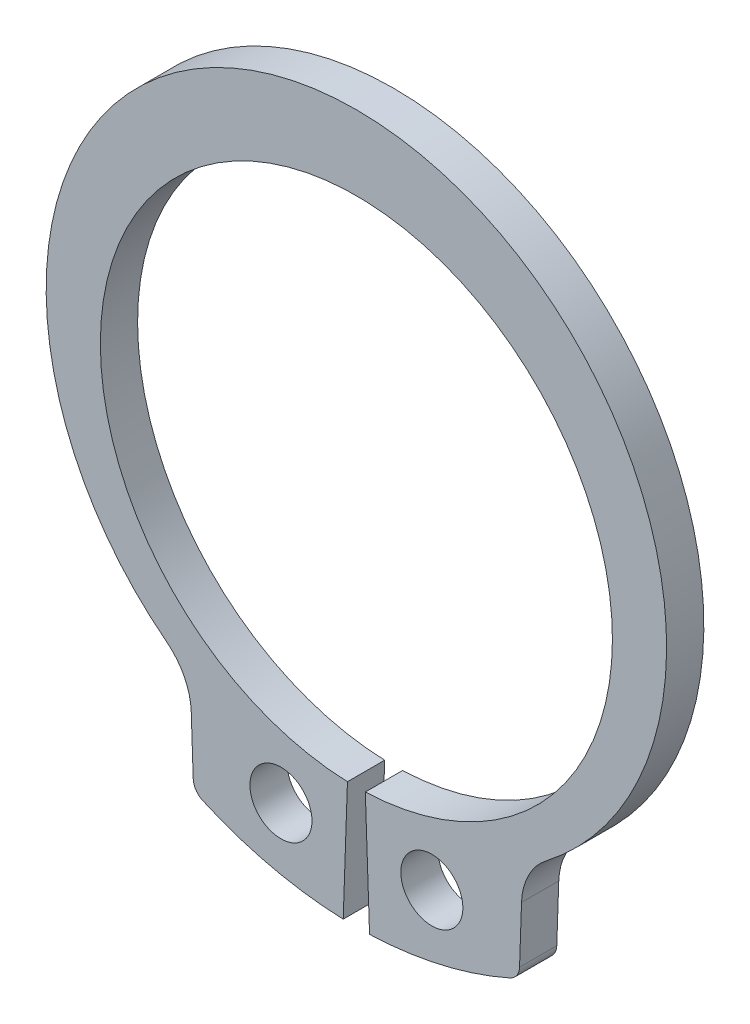
ISO-10303-21;
HEADER;
FILE_DESCRIPTION(('STEP AP214'),'2;1');
FILE_NAME('part.step','',(''),(''),'','','');
FILE_SCHEMA(('AUTOMOTIVE_DESIGN { 1 0 10303 214 1 1 1 1 }'));
ENDSEC;
DATA;
#1=APPLICATION_CONTEXT('core data for automotive mechanical design processes');
#2=APPLICATION_PROTOCOL_DEFINITION('international standard','automotive_design',2000,#1);
#3=PRODUCT_CONTEXT('',#1,'mechanical');
#4=PRODUCT('Part','Part','',(#3));
#5=PRODUCT_RELATED_PRODUCT_CATEGORY('part','',(#4));
#6=PRODUCT_DEFINITION_FORMATION('','',#4);
#7=PRODUCT_DEFINITION_CONTEXT('part definition',#1,'design');
#8=PRODUCT_DEFINITION('design','',#6,#7);
#9=PRODUCT_DEFINITION_SHAPE('','',#8);
#10=(LENGTH_UNIT() NAMED_UNIT(*) SI_UNIT(.MILLI.,.METRE.));
#11=(NAMED_UNIT(*) PLANE_ANGLE_UNIT() SI_UNIT($,.RADIAN.));
#12=(NAMED_UNIT(*) SI_UNIT($,.STERADIAN.) SOLID_ANGLE_UNIT());
#13=UNCERTAINTY_MEASURE_WITH_UNIT(LENGTH_MEASURE(1.E-05),#10,'distance_accuracy_value','');
#14=(GEOMETRIC_REPRESENTATION_CONTEXT(3) GLOBAL_UNCERTAINTY_ASSIGNED_CONTEXT((#13)) GLOBAL_UNIT_ASSIGNED_CONTEXT((#10,
#11,#12)) REPRESENTATION_CONTEXT('',''));
#15=CARTESIAN_POINT('',(0.,0.,0.));
#16=DIRECTION('',(0.,0.,1.));
#17=DIRECTION('',(1.,0.,0.));
#18=AXIS2_PLACEMENT_3D('',#15,#16,#17);
#19=CARTESIAN_POINT('',(0.,0.654185762562695,0.6));
#20=DIRECTION('',(0.,0.,1.));
#21=DIRECTION('',(1.,0.,0.));
#22=AXIS2_PLACEMENT_3D('',#19,#20,#21);
#23=PLANE('',#22);
#24=DIRECTION('',(0.034711024837078,-0.999397390808461,0.));
#25=VECTOR('',#24,1.);
#26=CARTESIAN_POINT('',(-5.24618005318946,-10.9672291215381,0.6));
#27=LINE('',#26,#25);
#28=CARTESIAN_POINT('',(-5.32111444925583,-8.8097232494977,0.6));
#29=VERTEX_POINT('',#28);
#30=CARTESIAN_POINT('',(-5.25720524863588,-10.6497924680824,0.6));
#31=VERTEX_POINT('',#30);
#32=EDGE_CURVE('E223',#29,#31,#27,.T.);
#33=ORIENTED_EDGE('',*,*,#32,.T.);
#34=CARTESIAN_POINT('',(-4.74125225751275,-10.6318724122023,0.6));
#35=DIRECTION('',(0.,0.,1.));
#36=DIRECTION('',(1.,0.,0.));
#37=AXIS2_PLACEMENT_3D('',#34,#35,#36);
#38=CIRCLE('',#37,0.51626409661301);
#39=CARTESIAN_POINT('',(-4.95151842741129,-11.1033771897474,0.6));
#40=VERTEX_POINT('',#39);
#41=EDGE_CURVE('E12',#31,#40,#38,.T.);
#42=ORIENTED_EDGE('',*,*,#41,.T.);
#43=CARTESIAN_POINT('',(0.,0.,0.6));
#44=DIRECTION('',(0.,0.,1.));
#45=DIRECTION('',(1.,0.,0.));
#46=AXIS2_PLACEMENT_3D('',#43,#44,#45);
#47=CIRCLE('',#46,12.1574059632307);
#48=CARTESIAN_POINT('',(-0.424287349324754,-12.15,0.6));
#49=VERTEX_POINT('',#48);
#50=EDGE_CURVE('E227',#40,#49,#47,.T.);
#51=ORIENTED_EDGE('',*,*,#50,.T.);
#52=DIRECTION('',(0.0348994967025026,0.999390827019096,0.));
#53=VECTOR('',#52,1.);
#54=CARTESIAN_POINT('',(-0.424287349324754,-12.15,0.6));
#55=LINE('',#54,#53);
#56=CARTESIAN_POINT('',(-0.287920847795646,-8.24497432290754,0.6));
#57=VERTEX_POINT('',#56);
#58=EDGE_CURVE('E230',#49,#57,#55,.T.);
#59=ORIENTED_EDGE('',*,*,#58,.T.);
#60=CARTESIAN_POINT('',(0.,0.,0.6));
#61=DIRECTION('',(0.,0.,-1.));
#62=DIRECTION('',(1.,0.,0.));
#63=AXIS2_PLACEMENT_3D('',#60,#61,#62);
#64=CIRCLE('',#63,8.25);
#65=CARTESIAN_POINT('',(0.287920847795642,-8.24497432290754,0.6));
#66=VERTEX_POINT('',#65);
#67=EDGE_CURVE('E165',#57,#66,#64,.T.);
#68=ORIENTED_EDGE('',*,*,#67,.T.);
#69=DIRECTION('',(-0.0348994967025021,0.999390827019096,0.));
#70=VECTOR('',#69,1.);
#71=CARTESIAN_POINT('',(0.424287349324748,-12.15,0.6));
#72=LINE('',#71,#70);
#73=CARTESIAN_POINT('',(0.424287349324748,-12.15,0.6));
#74=VERTEX_POINT('',#73);
#75=EDGE_CURVE('E143',#74,#66,#72,.T.);
#76=ORIENTED_EDGE('',*,*,#75,.F.);
#77=CARTESIAN_POINT('',(0.,0.,0.6));
#78=DIRECTION('',(0.,0.,-1.));
#79=DIRECTION('',(-1.,0.,0.));
#80=AXIS2_PLACEMENT_3D('',#77,#78,#79);
#81=CIRCLE('',#80,12.1574059632307);
#82=CARTESIAN_POINT('',(4.95151842741128,-11.1033771897474,0.6));
#83=VERTEX_POINT('',#82);
#84=EDGE_CURVE('E154',#83,#74,#81,.T.);
#85=ORIENTED_EDGE('',*,*,#84,.F.);
#86=CARTESIAN_POINT('',(4.74125225751275,-10.6318724122023,0.6));
#87=DIRECTION('',(0.,0.,-1.));
#88=DIRECTION('',(-1.,0.,0.));
#89=AXIS2_PLACEMENT_3D('',#86,#87,#88);
#90=CIRCLE('',#89,0.51626409661301);
#91=CARTESIAN_POINT('',(5.25720524863588,-10.6497924680824,0.6));
#92=VERTEX_POINT('',#91);
#93=EDGE_CURVE('E207',#92,#83,#90,.T.);
#94=ORIENTED_EDGE('',*,*,#93,.F.);
#95=DIRECTION('',(-0.0347110248370785,-0.999397390808461,0.));
#96=VECTOR('',#95,1.);
#97=CARTESIAN_POINT('',(5.24618005318946,-10.9672291215381,0.6));
#98=LINE('',#97,#96);
#99=CARTESIAN_POINT('',(5.32111444925583,-8.8097232494977,0.6));
#100=VERTEX_POINT('',#99);
#101=EDGE_CURVE('E161',#100,#92,#98,.T.);
#102=ORIENTED_EDGE('',*,*,#101,.F.);
#103=CARTESIAN_POINT('',(7.38492641374835,-8.88140347301781,0.6));
#104=DIRECTION('',(0.,0.,-1.));
#105=DIRECTION('',(-1.,0.,0.));
#106=AXIS2_PLACEMENT_3D('',#103,#104,#105);
#107=CIRCLE('',#106,2.06505638645204);
#108=CARTESIAN_POINT('',(6.12048291462129,-7.2487245343585,0.6));
#109=VERTEX_POINT('',#108);
#110=EDGE_CURVE('E194',#109,#100,#107,.F.);
#111=ORIENTED_EDGE('',*,*,#110,.F.);
#112=CARTESIAN_POINT('',(0.,0.654185762562695,0.6));
#113=DIRECTION('',(0.,0.,1.));
#114=DIRECTION('',(1.,0.,0.));
#115=AXIS2_PLACEMENT_3D('',#112,#113,#114);
#116=CIRCLE('',#115,9.9958142374373);
#117=CARTESIAN_POINT('',(-6.12048291462129,-7.2487245343585,0.6));
#118=VERTEX_POINT('',#117);
#119=EDGE_CURVE('E219',#109,#118,#116,.T.);
#120=ORIENTED_EDGE('',*,*,#119,.T.);
#121=CARTESIAN_POINT('',(-7.38492641374835,-8.8814034730178,0.6));
#122=DIRECTION('',(0.,0.,1.));
#123=DIRECTION('',(1.,0.,0.));
#124=AXIS2_PLACEMENT_3D('',#121,#122,#123);
#125=CIRCLE('',#124,2.06505638645204);
#126=EDGE_CURVE('E267',#118,#29,#125,.F.);
#127=ORIENTED_EDGE('',*,*,#126,.T.);
#128=EDGE_LOOP('',(#33,#42,#51,#59,#68,#76,#85,#94,#102,#111,#120,#127));
#129=FACE_BOUND('',#128,.T.);
#130=CARTESIAN_POINT('',(-2.43082406239009,-9.90992678654747,0.6));
#131=DIRECTION('',(0.,0.,1.));
#132=DIRECTION('',(1.,0.,0.));
#133=AXIS2_PLACEMENT_3D('',#130,#131,#132);
#134=CIRCLE('',#133,1.);
#135=CARTESIAN_POINT('',(-1.43082406239009,-9.90992678654747,0.6));
#136=VERTEX_POINT('',#135);
#137=EDGE_CURVE('E211',#136,#136,#134,.T.);
#138=ORIENTED_EDGE('',*,*,#137,.F.);
#139=EDGE_LOOP('',(#138));
#140=FACE_BOUND('',#139,.T.);
#141=CARTESIAN_POINT('',(2.43082406239009,-9.90992678654748,0.6));
#142=DIRECTION('',(0.,0.,-1.));
#143=DIRECTION('',(-1.,0.,0.));
#144=AXIS2_PLACEMENT_3D('',#141,#142,#143);
#145=CIRCLE('',#144,1.);
#146=CARTESIAN_POINT('',(1.43082406239009,-9.90992678654748,0.6));
#147=VERTEX_POINT('',#146);
#148=EDGE_CURVE('E179',#147,#147,#145,.T.);
#149=ORIENTED_EDGE('',*,*,#148,.T.);
#150=EDGE_LOOP('',(#149));
#151=FACE_BOUND('',#150,.T.);
#152=ADVANCED_FACE('F48',(#129,#140,#151),#23,.T.);
#153=CARTESIAN_POINT('',(0.,0.654185762562695,-0.6));
#154=DIRECTION('',(0.,0.,1.));
#155=DIRECTION('',(1.,0.,0.));
#156=AXIS2_PLACEMENT_3D('',#153,#154,#155);
#157=PLANE('',#156);
#158=CARTESIAN_POINT('',(0.,0.,-0.6));
#159=DIRECTION('',(0.,0.,1.));
#160=DIRECTION('',(1.,0.,0.));
#161=AXIS2_PLACEMENT_3D('',#158,#159,#160);
#162=CIRCLE('',#161,12.1574059632307);
#163=CARTESIAN_POINT('',(-4.95151842741129,-11.1033771897474,-0.6));
#164=VERTEX_POINT('',#163);
#165=CARTESIAN_POINT('',(-0.424287349324754,-12.15,-0.6));
#166=VERTEX_POINT('',#165);
#167=EDGE_CURVE('E242',#164,#166,#162,.T.);
#168=ORIENTED_EDGE('',*,*,#167,.F.);
#169=CARTESIAN_POINT('',(-4.74125225751275,-10.6318724122023,-0.6));
#170=DIRECTION('',(0.,0.,1.));
#171=DIRECTION('',(1.,0.,0.));
#172=AXIS2_PLACEMENT_3D('',#169,#170,#171);
#173=CIRCLE('',#172,0.51626409661301);
#174=CARTESIAN_POINT('',(-5.25720524863588,-10.6497924680824,-0.6));
#175=VERTEX_POINT('',#174);
#176=EDGE_CURVE('E71',#164,#175,#173,.F.);
#177=ORIENTED_EDGE('',*,*,#176,.T.);
#178=DIRECTION('',(0.034711024837078,-0.999397390808461,0.));
#179=VECTOR('',#178,1.);
#180=CARTESIAN_POINT('',(-5.24618005318946,-10.9672291215381,-0.6));
#181=LINE('',#180,#179);
#182=CARTESIAN_POINT('',(-5.32111444925583,-8.8097232494977,-0.6));
#183=VERTEX_POINT('',#182);
#184=EDGE_CURVE('E239',#183,#175,#181,.T.);
#185=ORIENTED_EDGE('',*,*,#184,.F.);
#186=CARTESIAN_POINT('',(-7.38492641374835,-8.8814034730178,-0.6));
#187=DIRECTION('',(0.,0.,1.));
#188=DIRECTION('',(1.,0.,0.));
#189=AXIS2_PLACEMENT_3D('',#186,#187,#188);
#190=CIRCLE('',#189,2.06505638645204);
#191=CARTESIAN_POINT('',(-6.12048291462129,-7.2487245343585,-0.6));
#192=VERTEX_POINT('',#191);
#193=EDGE_CURVE('E264',#183,#192,#190,.T.);
#194=ORIENTED_EDGE('',*,*,#193,.T.);
#195=CARTESIAN_POINT('',(0.,0.654185762562695,-0.6));
#196=DIRECTION('',(0.,0.,1.));
#197=DIRECTION('',(1.,0.,0.));
#198=AXIS2_PLACEMENT_3D('',#195,#196,#197);
#199=CIRCLE('',#198,9.9958142374373);
#200=CARTESIAN_POINT('',(6.12048291462129,-7.2487245343585,-0.6));
#201=VERTEX_POINT('',#200);
#202=EDGE_CURVE('E215',#201,#192,#199,.T.);
#203=ORIENTED_EDGE('',*,*,#202,.F.);
#204=CARTESIAN_POINT('',(7.38492641374835,-8.88140347301781,-0.6));
#205=DIRECTION('',(0.,0.,-1.));
#206=DIRECTION('',(-1.,0.,0.));
#207=AXIS2_PLACEMENT_3D('',#204,#205,#206);
#208=CIRCLE('',#207,2.06505638645204);
#209=CARTESIAN_POINT('',(5.32111444925583,-8.8097232494977,-0.6));
#210=VERTEX_POINT('',#209);
#211=EDGE_CURVE('E190',#210,#201,#208,.T.);
#212=ORIENTED_EDGE('',*,*,#211,.F.);
#213=DIRECTION('',(-0.0347110248370785,-0.999397390808461,0.));
#214=VECTOR('',#213,1.);
#215=CARTESIAN_POINT('',(5.24618005318946,-10.9672291215381,-0.6));
#216=LINE('',#215,#214);
#217=CARTESIAN_POINT('',(5.25720524863588,-10.6497924680824,-0.6));
#218=VERTEX_POINT('',#217);
#219=EDGE_CURVE('E174',#210,#218,#216,.T.);
#220=ORIENTED_EDGE('',*,*,#219,.T.);
#221=CARTESIAN_POINT('',(4.74125225751275,-10.6318724122023,-0.6));
#222=DIRECTION('',(0.,0.,-1.));
#223=DIRECTION('',(-1.,0.,0.));
#224=AXIS2_PLACEMENT_3D('',#221,#222,#223);
#225=CIRCLE('',#224,0.51626409661301);
#226=CARTESIAN_POINT('',(4.95151842741128,-11.1033771897474,-0.6));
#227=VERTEX_POINT('',#226);
#228=EDGE_CURVE('E200',#227,#218,#225,.F.);
#229=ORIENTED_EDGE('',*,*,#228,.F.);
#230=CARTESIAN_POINT('',(0.,0.,-0.6));
#231=DIRECTION('',(0.,0.,-1.));
#232=DIRECTION('',(-1.,0.,0.));
#233=AXIS2_PLACEMENT_3D('',#230,#231,#232);
#234=CIRCLE('',#233,12.1574059632307);
#235=CARTESIAN_POINT('',(0.424287349324748,-12.15,-0.6));
#236=VERTEX_POINT('',#235);
#237=EDGE_CURVE('E178',#227,#236,#234,.T.);
#238=ORIENTED_EDGE('',*,*,#237,.T.);
#239=DIRECTION('',(-0.0348994967025021,0.999390827019096,0.));
#240=VECTOR('',#239,1.);
#241=CARTESIAN_POINT('',(0.424287349324748,-12.15,-0.6));
#242=LINE('',#241,#240);
#243=CARTESIAN_POINT('',(0.287920847795642,-8.24497432290754,-0.6));
#244=VERTEX_POINT('',#243);
#245=EDGE_CURVE('E145',#236,#244,#242,.T.);
#246=ORIENTED_EDGE('',*,*,#245,.T.);
#247=CARTESIAN_POINT('',(0.,0.,-0.6));
#248=DIRECTION('',(0.,0.,-1.));
#249=DIRECTION('',(1.,0.,0.));
#250=AXIS2_PLACEMENT_3D('',#247,#248,#249);
#251=CIRCLE('',#250,8.25);
#252=CARTESIAN_POINT('',(-0.287920847795646,-8.24497432290754,-0.6));
#253=VERTEX_POINT('',#252);
#254=EDGE_CURVE('E224',#253,#244,#251,.T.);
#255=ORIENTED_EDGE('',*,*,#254,.F.);
#256=DIRECTION('',(0.0348994967025026,0.999390827019096,0.));
#257=VECTOR('',#256,1.);
#258=CARTESIAN_POINT('',(-0.424287349324754,-12.15,-0.6));
#259=LINE('',#258,#257);
#260=EDGE_CURVE('E245',#166,#253,#259,.T.);
#261=ORIENTED_EDGE('',*,*,#260,.F.);
#262=EDGE_LOOP('',(#168,#177,#185,#194,#203,#212,#220,#229,#238,#246,#255,#261));
#263=FACE_BOUND('',#262,.T.);
#264=CARTESIAN_POINT('',(-2.43082406239009,-9.90992678654747,-0.6));
#265=DIRECTION('',(0.,0.,1.));
#266=DIRECTION('',(1.,0.,0.));
#267=AXIS2_PLACEMENT_3D('',#264,#265,#266);
#268=CIRCLE('',#267,1.);
#269=CARTESIAN_POINT('',(-1.43082406239009,-9.90992678654747,-0.6));
#270=VERTEX_POINT('',#269);
#271=EDGE_CURVE('E210',#270,#270,#268,.T.);
#272=ORIENTED_EDGE('',*,*,#271,.T.);
#273=EDGE_LOOP('',(#272));
#274=FACE_BOUND('',#273,.T.);
#275=CARTESIAN_POINT('',(2.43082406239009,-9.90992678654748,-0.6));
#276=DIRECTION('',(0.,0.,-1.));
#277=DIRECTION('',(-1.,0.,0.));
#278=AXIS2_PLACEMENT_3D('',#275,#276,#277);
#279=CIRCLE('',#278,1.);
#280=CARTESIAN_POINT('',(1.43082406239009,-9.90992678654748,-0.6));
#281=VERTEX_POINT('',#280);
#282=EDGE_CURVE('E357',#281,#281,#279,.T.);
#283=ORIENTED_EDGE('',*,*,#282,.F.);
#284=EDGE_LOOP('',(#283));
#285=FACE_BOUND('',#284,.T.);
#286=ADVANCED_FACE('F367',(#263,#274,#285),#157,.F.);
#287=CARTESIAN_POINT('',(0.,0.654185762562695,0.6));
#288=DIRECTION('',(0.,0.,-1.));
#289=DIRECTION('',(-1.,0.,0.));
#290=AXIS2_PLACEMENT_3D('',#287,#288,#289);
#291=CYLINDRICAL_SURFACE('',#290,9.9958142374373);
#292=ORIENTED_EDGE('',*,*,#202,.T.);
#293=DIRECTION('',(0.,0.,-1.));
#294=VECTOR('',#293,1.);
#295=CARTESIAN_POINT('',(-6.12048291462129,-7.2487245343585,0.6));
#296=LINE('',#295,#294);
#297=EDGE_CURVE('E261',#192,#118,#296,.F.);
#298=ORIENTED_EDGE('',*,*,#297,.T.);
#299=ORIENTED_EDGE('',*,*,#119,.F.);
#300=DIRECTION('',(0.,0.,-1.));
#301=VECTOR('',#300,1.);
#302=CARTESIAN_POINT('',(6.12048291462129,-7.2487245343585,0.6));
#303=LINE('',#302,#301);
#304=EDGE_CURVE('E186',#201,#109,#303,.F.);
#305=ORIENTED_EDGE('',*,*,#304,.F.);
#306=EDGE_LOOP('',(#292,#298,#299,#305));
#307=FACE_BOUND('',#306,.T.);
#308=ADVANCED_FACE('F369',(#307),#291,.T.);
#309=CARTESIAN_POINT('',(-5.24618005318946,-10.9672291215381,0.6));
#310=DIRECTION('',(0.999397390808461,0.034711024837078,0.));
#311=DIRECTION('',(-0.034711024837078,0.999397390808461,0.));
#312=AXIS2_PLACEMENT_3D('',#309,#310,#311);
#313=PLANE('',#312);
#314=ORIENTED_EDGE('',*,*,#184,.T.);
#315=DIRECTION('',(0.,0.,-1.));
#316=VECTOR('',#315,1.);
#317=CARTESIAN_POINT('',(-5.25720524863588,-10.6497924680824,0.6));
#318=LINE('',#317,#316);
#319=EDGE_CURVE('E57',#175,#31,#318,.F.);
#320=ORIENTED_EDGE('',*,*,#319,.T.);
#321=ORIENTED_EDGE('',*,*,#32,.F.);
#322=DIRECTION('',(0.,0.,1.));
#323=VECTOR('',#322,1.);
#324=CARTESIAN_POINT('',(-5.32111444925583,-8.8097232494977,-0.6));
#325=LINE('',#324,#323);
#326=EDGE_CURVE('E257',#29,#183,#325,.F.);
#327=ORIENTED_EDGE('',*,*,#326,.T.);
#328=EDGE_LOOP('',(#314,#320,#321,#327));
#329=FACE_BOUND('',#328,.T.);
#330=ADVANCED_FACE('F375',(#329),#313,.F.);
#331=CARTESIAN_POINT('',(0.,0.,0.6));
#332=DIRECTION('',(0.,0.,-1.));
#333=DIRECTION('',(-1.,0.,0.));
#334=AXIS2_PLACEMENT_3D('',#331,#332,#333);
#335=CYLINDRICAL_SURFACE('',#334,12.1574059632307);
#336=ORIENTED_EDGE('',*,*,#50,.F.);
#337=DIRECTION('',(0.,0.,-1.));
#338=VECTOR('',#337,1.);
#339=CARTESIAN_POINT('',(-4.95151842741129,-11.1033771897474,0.6));
#340=LINE('',#339,#338);
#341=EDGE_CURVE('E270',#40,#164,#340,.T.);
#342=ORIENTED_EDGE('',*,*,#341,.T.);
#343=ORIENTED_EDGE('',*,*,#167,.T.);
#344=DIRECTION('',(0.,0.,-1.));
#345=VECTOR('',#344,1.);
#346=CARTESIAN_POINT('',(-0.424287349324754,-12.15,0.6));
#347=LINE('',#346,#345);
#348=EDGE_CURVE('E253',#49,#166,#347,.T.);
#349=ORIENTED_EDGE('',*,*,#348,.F.);
#350=EDGE_LOOP('',(#336,#342,#343,#349));
#351=FACE_BOUND('',#350,.T.);
#352=ADVANCED_FACE('F390',(#351),#335,.T.);
#353=CARTESIAN_POINT('',(-0.424287349324754,-12.15,0.6));
#354=DIRECTION('',(-0.999390827019096,0.0348994967025026,0.));
#355=DIRECTION('',(-0.0348994967025026,-0.999390827019096,0.));
#356=AXIS2_PLACEMENT_3D('',#353,#354,#355);
#357=PLANE('',#356);
#358=ORIENTED_EDGE('',*,*,#260,.T.);
#359=DIRECTION('',(0.,0.,-1.));
#360=VECTOR('',#359,1.);
#361=CARTESIAN_POINT('',(-0.287920847795646,-8.24497432290754,0.6));
#362=LINE('',#361,#360);
#363=EDGE_CURVE('E235',#57,#253,#362,.T.);
#364=ORIENTED_EDGE('',*,*,#363,.F.);
#365=ORIENTED_EDGE('',*,*,#58,.F.);
#366=ORIENTED_EDGE('',*,*,#348,.T.);
#367=EDGE_LOOP('',(#358,#364,#365,#366));
#368=FACE_BOUND('',#367,.T.);
#369=ADVANCED_FACE('F386',(#368),#357,.F.);
#370=CARTESIAN_POINT('',(0.,0.,0.6));
#371=DIRECTION('',(0.,0.,-1.));
#372=DIRECTION('',(-1.,0.,0.));
#373=AXIS2_PLACEMENT_3D('',#370,#371,#372);
#374=CYLINDRICAL_SURFACE('',#373,8.25);
#375=ORIENTED_EDGE('',*,*,#254,.T.);
#376=DIRECTION('',(0.,0.,-1.));
#377=VECTOR('',#376,1.);
#378=CARTESIAN_POINT('',(0.287920847795642,-8.24497432290754,0.6));
#379=LINE('',#378,#377);
#380=EDGE_CURVE('E151',#66,#244,#379,.T.);
#381=ORIENTED_EDGE('',*,*,#380,.F.);
#382=ORIENTED_EDGE('',*,*,#67,.F.);
#383=ORIENTED_EDGE('',*,*,#363,.T.);
#384=EDGE_LOOP('',(#375,#381,#382,#383));
#385=FACE_BOUND('',#384,.T.);
#386=ADVANCED_FACE('F382',(#385),#374,.F.);
#387=CARTESIAN_POINT('',(-2.43082406239009,-9.90992678654747,0.6));
#388=DIRECTION('',(0.,0.,-1.));
#389=DIRECTION('',(-1.,0.,0.));
#390=AXIS2_PLACEMENT_3D('',#387,#388,#389);
#391=CYLINDRICAL_SURFACE('',#390,1.);
#392=ORIENTED_EDGE('',*,*,#137,.T.);
#393=EDGE_LOOP('',(#392));
#394=FACE_BOUND('',#393,.T.);
#395=ORIENTED_EDGE('',*,*,#271,.F.);
#396=EDGE_LOOP('',(#395));
#397=FACE_BOUND('',#396,.T.);
#398=ADVANCED_FACE('F385',(#394,#397),#391,.F.);
#399=CARTESIAN_POINT('',(-7.38492641374835,-8.8814034730178,0.6));
#400=DIRECTION('',(0.,0.,-1.));
#401=DIRECTION('',(-1.,0.,0.));
#402=AXIS2_PLACEMENT_3D('',#399,#400,#401);
#403=CYLINDRICAL_SURFACE('',#402,2.06505638645204);
#404=ORIENTED_EDGE('',*,*,#126,.F.);
#405=ORIENTED_EDGE('',*,*,#297,.F.);
#406=ORIENTED_EDGE('',*,*,#193,.F.);
#407=ORIENTED_EDGE('',*,*,#326,.F.);
#408=EDGE_LOOP('',(#404,#405,#406,#407));
#409=FACE_BOUND('',#408,.T.);
#410=ADVANCED_FACE('F396',(#409),#403,.F.);
#411=CARTESIAN_POINT('',(-4.74125225751275,-10.6318724122023,0.6));
#412=DIRECTION('',(0.,0.,-1.));
#413=DIRECTION('',(-1.,0.,0.));
#414=AXIS2_PLACEMENT_3D('',#411,#412,#413);
#415=CYLINDRICAL_SURFACE('',#414,0.51626409661301);
#416=ORIENTED_EDGE('',*,*,#41,.F.);
#417=ORIENTED_EDGE('',*,*,#319,.F.);
#418=ORIENTED_EDGE('',*,*,#176,.F.);
#419=ORIENTED_EDGE('',*,*,#341,.F.);
#420=EDGE_LOOP('',(#416,#417,#418,#419));
#421=FACE_BOUND('',#420,.T.);
#422=ADVANCED_FACE('F50',(#421),#415,.T.);
#423=CARTESIAN_POINT('',(5.24618005318946,-10.9672291215381,0.6));
#424=DIRECTION('',(-0.999397390808461,0.0347110248370785,0.));
#425=DIRECTION('',(0.0347110248370785,0.999397390808461,0.));
#426=AXIS2_PLACEMENT_3D('',#423,#424,#425);
#427=PLANE('',#426);
#428=ORIENTED_EDGE('',*,*,#219,.F.);
#429=DIRECTION('',(0.,0.,1.));
#430=VECTOR('',#429,1.);
#431=CARTESIAN_POINT('',(5.32111444925583,-8.8097232494977,-0.6));
#432=LINE('',#431,#430);
#433=EDGE_CURVE('E150',#100,#210,#432,.F.);
#434=ORIENTED_EDGE('',*,*,#433,.F.);
#435=ORIENTED_EDGE('',*,*,#101,.T.);
#436=DIRECTION('',(0.,0.,-1.));
#437=VECTOR('',#436,1.);
#438=CARTESIAN_POINT('',(5.25720524863588,-10.6497924680824,0.6));
#439=LINE('',#438,#437);
#440=EDGE_CURVE('E204',#218,#92,#439,.F.);
#441=ORIENTED_EDGE('',*,*,#440,.F.);
#442=EDGE_LOOP('',(#428,#434,#435,#441));
#443=FACE_BOUND('',#442,.T.);
#444=ADVANCED_FACE('F403',(#443),#427,.F.);
#445=CARTESIAN_POINT('',(0.,0.,0.6));
#446=DIRECTION('',(0.,0.,-1.));
#447=DIRECTION('',(1.,0.,0.));
#448=AXIS2_PLACEMENT_3D('',#445,#446,#447);
#449=CYLINDRICAL_SURFACE('',#448,12.1574059632307);
#450=ORIENTED_EDGE('',*,*,#84,.T.);
#451=DIRECTION('',(0.,0.,-1.));
#452=VECTOR('',#451,1.);
#453=CARTESIAN_POINT('',(0.424287349324748,-12.15,0.6));
#454=LINE('',#453,#452);
#455=EDGE_CURVE('E138',#74,#236,#454,.T.);
#456=ORIENTED_EDGE('',*,*,#455,.T.);
#457=ORIENTED_EDGE('',*,*,#237,.F.);
#458=DIRECTION('',(0.,0.,-1.));
#459=VECTOR('',#458,1.);
#460=CARTESIAN_POINT('',(4.95151842741128,-11.1033771897474,0.6));
#461=LINE('',#460,#459);
#462=EDGE_CURVE('E156',#83,#227,#461,.T.);
#463=ORIENTED_EDGE('',*,*,#462,.F.);
#464=EDGE_LOOP('',(#450,#456,#457,#463));
#465=FACE_BOUND('',#464,.T.);
#466=ADVANCED_FACE('F155',(#465),#449,.T.);
#467=CARTESIAN_POINT('',(0.424287349324748,-12.15,0.6));
#468=DIRECTION('',(0.999390827019096,0.0348994967025021,0.));
#469=DIRECTION('',(0.0348994967025021,-0.999390827019096,0.));
#470=AXIS2_PLACEMENT_3D('',#467,#468,#469);
#471=PLANE('',#470);
#472=ORIENTED_EDGE('',*,*,#245,.F.);
#473=ORIENTED_EDGE('',*,*,#455,.F.);
#474=ORIENTED_EDGE('',*,*,#75,.T.);
#475=ORIENTED_EDGE('',*,*,#380,.T.);
#476=EDGE_LOOP('',(#472,#473,#474,#475));
#477=FACE_BOUND('',#476,.T.);
#478=ADVANCED_FACE('F140',(#477),#471,.F.);
#479=CARTESIAN_POINT('',(2.43082406239009,-9.90992678654748,0.6));
#480=DIRECTION('',(0.,0.,-1.));
#481=DIRECTION('',(1.,0.,0.));
#482=AXIS2_PLACEMENT_3D('',#479,#480,#481);
#483=CYLINDRICAL_SURFACE('',#482,1.);
#484=ORIENTED_EDGE('',*,*,#148,.F.);
#485=EDGE_LOOP('',(#484));
#486=FACE_BOUND('',#485,.T.);
#487=ORIENTED_EDGE('',*,*,#282,.T.);
#488=EDGE_LOOP('',(#487));
#489=FACE_BOUND('',#488,.T.);
#490=ADVANCED_FACE('F365',(#486,#489),#483,.F.);
#491=CARTESIAN_POINT('',(7.38492641374835,-8.88140347301781,0.6));
#492=DIRECTION('',(0.,0.,-1.));
#493=DIRECTION('',(1.,0.,0.));
#494=AXIS2_PLACEMENT_3D('',#491,#492,#493);
#495=CYLINDRICAL_SURFACE('',#494,2.06505638645204);
#496=ORIENTED_EDGE('',*,*,#110,.T.);
#497=ORIENTED_EDGE('',*,*,#433,.T.);
#498=ORIENTED_EDGE('',*,*,#211,.T.);
#499=ORIENTED_EDGE('',*,*,#304,.T.);
#500=EDGE_LOOP('',(#496,#497,#498,#499));
#501=FACE_BOUND('',#500,.T.);
#502=ADVANCED_FACE('F414',(#501),#495,.F.);
#503=CARTESIAN_POINT('',(4.74125225751275,-10.6318724122023,0.6));
#504=DIRECTION('',(0.,0.,-1.));
#505=DIRECTION('',(1.,0.,0.));
#506=AXIS2_PLACEMENT_3D('',#503,#504,#505);
#507=CYLINDRICAL_SURFACE('',#506,0.51626409661301);
#508=ORIENTED_EDGE('',*,*,#93,.T.);
#509=ORIENTED_EDGE('',*,*,#462,.T.);
#510=ORIENTED_EDGE('',*,*,#228,.T.);
#511=ORIENTED_EDGE('',*,*,#440,.T.);
#512=EDGE_LOOP('',(#508,#509,#510,#511));
#513=FACE_BOUND('',#512,.T.);
#514=ADVANCED_FACE('F420',(#513),#507,.T.);
#515=CLOSED_SHELL('',(#152,#286,#308,#330,#352,#369,#386,#398,#410,#422,#444,#466,#478,#490,
#502,#514));
#516=MANIFOLD_SOLID_BREP('B2',#515);
#517=ADVANCED_BREP_SHAPE_REPRESENTATION('',(#18,#516),#14);
#518=SHAPE_DEFINITION_REPRESENTATION(#9,#517);
ENDSEC;
END-ISO-10303-21;
